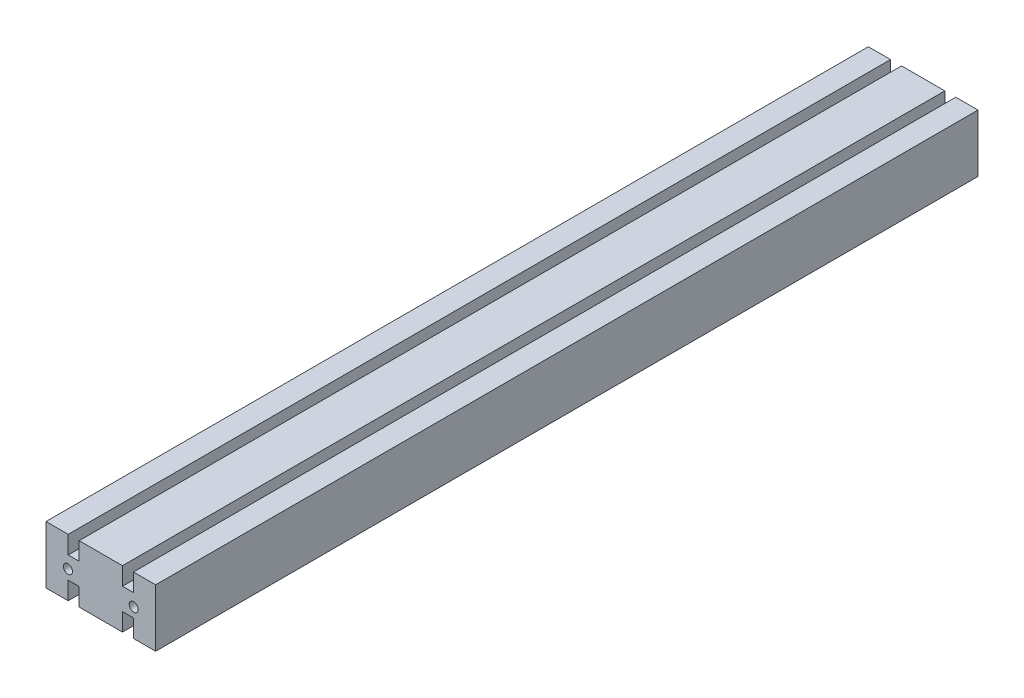
ISO-10303-21;
HEADER;
FILE_DESCRIPTION(('STEP AP214'),'2;1');
FILE_NAME('part.step','',(''),(''),'','','');
FILE_SCHEMA(('AUTOMOTIVE_DESIGN { 1 0 10303 214 1 1 1 1 }'));
ENDSEC;
DATA;
#1=APPLICATION_CONTEXT('core data for automotive mechanical design processes');
#2=APPLICATION_PROTOCOL_DEFINITION('international standard','automotive_design',2000,#1);
#3=PRODUCT_CONTEXT('',#1,'mechanical');
#4=PRODUCT('Part','Part','',(#3));
#5=PRODUCT_RELATED_PRODUCT_CATEGORY('part','',(#4));
#6=PRODUCT_DEFINITION_FORMATION('','',#4);
#7=PRODUCT_DEFINITION_CONTEXT('part definition',#1,'design');
#8=PRODUCT_DEFINITION('design','',#6,#7);
#9=PRODUCT_DEFINITION_SHAPE('','',#8);
#10=(LENGTH_UNIT() NAMED_UNIT(*) SI_UNIT(.MILLI.,.METRE.));
#11=(NAMED_UNIT(*) PLANE_ANGLE_UNIT() SI_UNIT($,.RADIAN.));
#12=(NAMED_UNIT(*) SI_UNIT($,.STERADIAN.) SOLID_ANGLE_UNIT());
#13=UNCERTAINTY_MEASURE_WITH_UNIT(LENGTH_MEASURE(1.E-05),#10,'distance_accuracy_value','');
#14=(GEOMETRIC_REPRESENTATION_CONTEXT(3) GLOBAL_UNCERTAINTY_ASSIGNED_CONTEXT((#13)) GLOBAL_UNIT_ASSIGNED_CONTEXT((#10,
#11,#12)) REPRESENTATION_CONTEXT('',''));
#15=CARTESIAN_POINT('',(0.,0.,0.));
#16=DIRECTION('',(0.,0.,1.));
#17=DIRECTION('',(1.,0.,0.));
#18=AXIS2_PLACEMENT_3D('',#15,#16,#17);
#19=CARTESIAN_POINT('',(-20.,10.5,150.));
#20=DIRECTION('',(0.,-1.,0.));
#21=DIRECTION('',(0.,0.,-1.));
#22=AXIS2_PLACEMENT_3D('',#19,#20,#21);
#23=PLANE('',#22);
#24=DIRECTION('',(-1.,0.,0.));
#25=VECTOR('',#24,1.);
#26=CARTESIAN_POINT('',(-20.,10.5,-150.));
#27=LINE('',#26,#25);
#28=CARTESIAN_POINT('',(7.9,10.5,-150.));
#29=VERTEX_POINT('',#28);
#30=CARTESIAN_POINT('',(-7.90000000000006,10.4999999999999,-150.));
#31=VERTEX_POINT('',#30);
#32=EDGE_CURVE('E343',#29,#31,#27,.T.);
#33=ORIENTED_EDGE('',*,*,#32,.T.);
#34=DIRECTION('',(0.,0.,1.));
#35=VECTOR('',#34,1.);
#36=CARTESIAN_POINT('',(-7.90000000000006,10.4999999999999,-150.));
#37=LINE('',#36,#35);
#38=CARTESIAN_POINT('',(-7.90000000000006,10.4999999999999,150.));
#39=VERTEX_POINT('',#38);
#40=EDGE_CURVE('E261',#31,#39,#37,.T.);
#41=ORIENTED_EDGE('',*,*,#40,.T.);
#42=DIRECTION('',(-1.,0.,0.));
#43=VECTOR('',#42,1.);
#44=CARTESIAN_POINT('',(-20.,10.5,150.));
#45=LINE('',#44,#43);
#46=CARTESIAN_POINT('',(7.9,10.5,150.));
#47=VERTEX_POINT('',#46);
#48=EDGE_CURVE('E328',#47,#39,#45,.T.);
#49=ORIENTED_EDGE('',*,*,#48,.F.);
#50=DIRECTION('',(0.,0.,1.));
#51=VECTOR('',#50,1.);
#52=CARTESIAN_POINT('',(7.9,10.5,-150.));
#53=LINE('',#52,#51);
#54=EDGE_CURVE('E310',#29,#47,#53,.T.);
#55=ORIENTED_EDGE('',*,*,#54,.F.);
#56=EDGE_LOOP('',(#33,#41,#49,#55));
#57=FACE_BOUND('',#56,.T.);
#58=ADVANCED_FACE('F38',(#57),#23,.F.);
#59=CARTESIAN_POINT('',(-11.9000000000001,10.4999999999999,150.));
#60=VERTEX_POINT('',#59);
#61=CARTESIAN_POINT('',(-20.,10.5,150.));
#62=VERTEX_POINT('',#61);
#63=EDGE_CURVE('E322',#60,#62,#45,.T.);
#64=ORIENTED_EDGE('',*,*,#63,.F.);
#65=DIRECTION('',(0.,0.,1.));
#66=VECTOR('',#65,1.);
#67=CARTESIAN_POINT('',(-11.9000000000001,10.4999999999999,-150.));
#68=LINE('',#67,#66);
#69=CARTESIAN_POINT('',(-11.9000000000001,10.4999999999999,-150.));
#70=VERTEX_POINT('',#69);
#71=EDGE_CURVE('E267',#70,#60,#68,.T.);
#72=ORIENTED_EDGE('',*,*,#71,.F.);
#73=CARTESIAN_POINT('',(-20.,10.5,-150.));
#74=VERTEX_POINT('',#73);
#75=EDGE_CURVE('E338',#70,#74,#27,.T.);
#76=ORIENTED_EDGE('',*,*,#75,.T.);
#77=DIRECTION('',(0.,0.,-1.));
#78=VECTOR('',#77,1.);
#79=CARTESIAN_POINT('',(-20.,10.5,150.));
#80=LINE('',#79,#78);
#81=EDGE_CURVE('E46',#62,#74,#80,.T.);
#82=ORIENTED_EDGE('',*,*,#81,.F.);
#83=EDGE_LOOP('',(#64,#72,#76,#82));
#84=FACE_BOUND('',#83,.T.);
#85=ADVANCED_FACE('F390',(#84),#23,.F.);
#86=CARTESIAN_POINT('',(-20.,-10.5,150.));
#87=DIRECTION('',(0.,1.,0.));
#88=DIRECTION('',(0.,0.,1.));
#89=AXIS2_PLACEMENT_3D('',#86,#87,#88);
#90=PLANE('',#89);
#91=DIRECTION('',(1.,0.,0.));
#92=VECTOR('',#91,1.);
#93=CARTESIAN_POINT('',(-20.,-10.5,-150.));
#94=LINE('',#93,#92);
#95=CARTESIAN_POINT('',(-7.90000000000008,-10.4999999999999,-150.));
#96=VERTEX_POINT('',#95);
#97=CARTESIAN_POINT('',(7.89999999999997,-10.5,-150.));
#98=VERTEX_POINT('',#97);
#99=EDGE_CURVE('E348',#96,#98,#94,.T.);
#100=ORIENTED_EDGE('',*,*,#99,.T.);
#101=DIRECTION('',(0.,0.,1.));
#102=VECTOR('',#101,1.);
#103=CARTESIAN_POINT('',(7.89999999999997,-10.5,-150.));
#104=LINE('',#103,#102);
#105=CARTESIAN_POINT('',(7.89999999999997,-10.5,150.));
#106=VERTEX_POINT('',#105);
#107=EDGE_CURVE('E285',#98,#106,#104,.T.);
#108=ORIENTED_EDGE('',*,*,#107,.T.);
#109=DIRECTION('',(1.,0.,0.));
#110=VECTOR('',#109,1.);
#111=CARTESIAN_POINT('',(-20.,-10.5,150.));
#112=LINE('',#111,#110);
#113=CARTESIAN_POINT('',(-7.90000000000008,-10.4999999999999,150.));
#114=VERTEX_POINT('',#113);
#115=EDGE_CURVE('E335',#114,#106,#112,.T.);
#116=ORIENTED_EDGE('',*,*,#115,.F.);
#117=DIRECTION('',(0.,0.,1.));
#118=VECTOR('',#117,1.);
#119=CARTESIAN_POINT('',(-7.90000000000008,-10.4999999999999,-150.));
#120=LINE('',#119,#118);
#121=EDGE_CURVE('E236',#96,#114,#120,.T.);
#122=ORIENTED_EDGE('',*,*,#121,.F.);
#123=EDGE_LOOP('',(#100,#108,#116,#122));
#124=FACE_BOUND('',#123,.T.);
#125=ADVANCED_FACE('F392',(#124),#90,.F.);
#126=CARTESIAN_POINT('',(11.9,-10.5,150.));
#127=VERTEX_POINT('',#126);
#128=CARTESIAN_POINT('',(20.,-10.5,150.));
#129=VERTEX_POINT('',#128);
#130=EDGE_CURVE('E330',#127,#129,#112,.T.);
#131=ORIENTED_EDGE('',*,*,#130,.F.);
#132=DIRECTION('',(0.,0.,1.));
#133=VECTOR('',#132,1.);
#134=CARTESIAN_POINT('',(11.9,-10.5,-150.));
#135=LINE('',#134,#133);
#136=CARTESIAN_POINT('',(11.9,-10.5,-150.));
#137=VERTEX_POINT('',#136);
#138=EDGE_CURVE('E289',#137,#127,#135,.T.);
#139=ORIENTED_EDGE('',*,*,#138,.F.);
#140=CARTESIAN_POINT('',(20.,-10.5,-150.));
#141=VERTEX_POINT('',#140);
#142=EDGE_CURVE('E345',#137,#141,#94,.T.);
#143=ORIENTED_EDGE('',*,*,#142,.T.);
#144=DIRECTION('',(0.,0.,-1.));
#145=VECTOR('',#144,1.);
#146=CARTESIAN_POINT('',(20.,-10.5,150.));
#147=LINE('',#146,#145);
#148=EDGE_CURVE('E334',#129,#141,#147,.T.);
#149=ORIENTED_EDGE('',*,*,#148,.F.);
#150=EDGE_LOOP('',(#131,#139,#143,#149));
#151=FACE_BOUND('',#150,.T.);
#152=ADVANCED_FACE('F398',(#151),#90,.F.);
#153=CARTESIAN_POINT('',(20.,-10.5,150.));
#154=DIRECTION('',(-1.,0.,0.));
#155=DIRECTION('',(0.,0.,1.));
#156=AXIS2_PLACEMENT_3D('',#153,#154,#155);
#157=PLANE('',#156);
#158=DIRECTION('',(0.,1.,0.));
#159=VECTOR('',#158,1.);
#160=CARTESIAN_POINT('',(20.,-10.5,-150.));
#161=LINE('',#160,#159);
#162=CARTESIAN_POINT('',(20.,10.5,-150.));
#163=VERTEX_POINT('',#162);
#164=EDGE_CURVE('E312',#141,#163,#161,.T.);
#165=ORIENTED_EDGE('',*,*,#164,.T.);
#166=DIRECTION('',(0.,0.,-1.));
#167=VECTOR('',#166,1.);
#168=CARTESIAN_POINT('',(20.,10.5,150.));
#169=LINE('',#168,#167);
#170=CARTESIAN_POINT('',(20.,10.5,150.));
#171=VERTEX_POINT('',#170);
#172=EDGE_CURVE('E11',#171,#163,#169,.T.);
#173=ORIENTED_EDGE('',*,*,#172,.F.);
#174=DIRECTION('',(0.,1.,0.));
#175=VECTOR('',#174,1.);
#176=CARTESIAN_POINT('',(20.,-10.5,150.));
#177=LINE('',#176,#175);
#178=EDGE_CURVE('E319',#129,#171,#177,.T.);
#179=ORIENTED_EDGE('',*,*,#178,.F.);
#180=ORIENTED_EDGE('',*,*,#148,.T.);
#181=EDGE_LOOP('',(#165,#173,#179,#180));
#182=FACE_BOUND('',#181,.T.);
#183=ADVANCED_FACE('F40',(#182),#157,.F.);
#184=CARTESIAN_POINT('',(11.9,10.5,-150.));
#185=VERTEX_POINT('',#184);
#186=EDGE_CURVE('E339',#163,#185,#27,.T.);
#187=ORIENTED_EDGE('',*,*,#186,.T.);
#188=DIRECTION('',(0.,0.,1.));
#189=VECTOR('',#188,1.);
#190=CARTESIAN_POINT('',(11.9,10.5,-150.));
#191=LINE('',#190,#189);
#192=CARTESIAN_POINT('',(11.9,10.5,150.));
#193=VERTEX_POINT('',#192);
#194=EDGE_CURVE('E313',#185,#193,#191,.T.);
#195=ORIENTED_EDGE('',*,*,#194,.T.);
#196=EDGE_CURVE('E324',#171,#193,#45,.T.);
#197=ORIENTED_EDGE('',*,*,#196,.F.);
#198=ORIENTED_EDGE('',*,*,#172,.T.);
#199=EDGE_LOOP('',(#187,#195,#197,#198));
#200=FACE_BOUND('',#199,.T.);
#201=ADVANCED_FACE('F393',(#200),#23,.F.);
#202=CARTESIAN_POINT('',(-20.,-10.5,150.));
#203=DIRECTION('',(1.,0.,0.));
#204=DIRECTION('',(0.,0.,-1.));
#205=AXIS2_PLACEMENT_3D('',#202,#203,#204);
#206=PLANE('',#205);
#207=DIRECTION('',(0.,-1.,0.));
#208=VECTOR('',#207,1.);
#209=CARTESIAN_POINT('',(-20.,-10.5,-150.));
#210=LINE('',#209,#208);
#211=CARTESIAN_POINT('',(-20.,-10.5,-150.));
#212=VERTEX_POINT('',#211);
#213=EDGE_CURVE('E342',#74,#212,#210,.T.);
#214=ORIENTED_EDGE('',*,*,#213,.T.);
#215=DIRECTION('',(0.,0.,-1.));
#216=VECTOR('',#215,1.);
#217=CARTESIAN_POINT('',(-20.,-10.5,150.));
#218=LINE('',#217,#216);
#219=CARTESIAN_POINT('',(-20.,-10.5,150.));
#220=VERTEX_POINT('',#219);
#221=EDGE_CURVE('E351',#220,#212,#218,.T.);
#222=ORIENTED_EDGE('',*,*,#221,.F.);
#223=DIRECTION('',(0.,-1.,0.));
#224=VECTOR('',#223,1.);
#225=CARTESIAN_POINT('',(-20.,-10.5,150.));
#226=LINE('',#225,#224);
#227=EDGE_CURVE('E327',#62,#220,#226,.T.);
#228=ORIENTED_EDGE('',*,*,#227,.F.);
#229=ORIENTED_EDGE('',*,*,#81,.T.);
#230=EDGE_LOOP('',(#214,#222,#228,#229));
#231=FACE_BOUND('',#230,.T.);
#232=ADVANCED_FACE('F358',(#231),#206,.F.);
#233=CARTESIAN_POINT('',(-11.9000000000001,-10.4999999999999,-150.));
#234=VERTEX_POINT('',#233);
#235=EDGE_CURVE('E323',#212,#234,#94,.T.);
#236=ORIENTED_EDGE('',*,*,#235,.T.);
#237=DIRECTION('',(0.,0.,1.));
#238=VECTOR('',#237,1.);
#239=CARTESIAN_POINT('',(-11.9000000000001,-10.4999999999999,-150.));
#240=LINE('',#239,#238);
#241=CARTESIAN_POINT('',(-11.9000000000001,-10.4999999999999,150.));
#242=VERTEX_POINT('',#241);
#243=EDGE_CURVE('E239',#234,#242,#240,.T.);
#244=ORIENTED_EDGE('',*,*,#243,.T.);
#245=EDGE_CURVE('E331',#220,#242,#112,.T.);
#246=ORIENTED_EDGE('',*,*,#245,.F.);
#247=ORIENTED_EDGE('',*,*,#221,.T.);
#248=EDGE_LOOP('',(#236,#244,#246,#247));
#249=FACE_BOUND('',#248,.T.);
#250=ADVANCED_FACE('F367',(#249),#90,.F.);
#251=CARTESIAN_POINT('',(0.,0.,150.));
#252=DIRECTION('',(0.,0.,-1.));
#253=DIRECTION('',(-1.,0.,0.));
#254=AXIS2_PLACEMENT_3D('',#251,#252,#253);
#255=PLANE('',#254);
#256=CARTESIAN_POINT('',(-12.,-0.499999999999919,150.));
#257=DIRECTION('',(0.,0.,1.));
#258=DIRECTION('',(1.,0.,0.));
#259=AXIS2_PLACEMENT_3D('',#256,#257,#258);
#260=CIRCLE('',#259,1.65);
#261=CARTESIAN_POINT('',(-10.35,-0.499999999999919,150.));
#262=VERTEX_POINT('',#261);
#263=EDGE_CURVE('E206',#262,#262,#260,.T.);
#264=ORIENTED_EDGE('',*,*,#263,.F.);
#265=EDGE_LOOP('',(#264));
#266=FACE_BOUND('',#265,.T.);
#267=CARTESIAN_POINT('',(12.,-0.499999999999914,150.));
#268=DIRECTION('',(0.,0.,1.));
#269=DIRECTION('',(1.,0.,0.));
#270=AXIS2_PLACEMENT_3D('',#267,#268,#269);
#271=CIRCLE('',#270,1.65);
#272=CARTESIAN_POINT('',(13.65,-0.499999999999914,150.));
#273=VERTEX_POINT('',#272);
#274=EDGE_CURVE('E212',#273,#273,#271,.T.);
#275=ORIENTED_EDGE('',*,*,#274,.F.);
#276=EDGE_LOOP('',(#275));
#277=FACE_BOUND('',#276,.T.);
#278=ORIENTED_EDGE('',*,*,#48,.T.);
#279=DIRECTION('',(0.,1.,0.));
#280=VECTOR('',#279,1.);
#281=CARTESIAN_POINT('',(-7.90000000000006,10.4999999999999,150.));
#282=LINE('',#281,#280);
#283=CARTESIAN_POINT('',(-7.90000000000002,3.99999999999994,150.));
#284=VERTEX_POINT('',#283);
#285=EDGE_CURVE('E245',#284,#39,#282,.T.);
#286=ORIENTED_EDGE('',*,*,#285,.F.);
#287=DIRECTION('',(1.,0.,0.));
#288=VECTOR('',#287,1.);
#289=CARTESIAN_POINT('',(-7.90000000000002,3.99999999999994,150.));
#290=LINE('',#289,#288);
#291=CARTESIAN_POINT('',(-11.9,3.99999999999992,150.));
#292=VERTEX_POINT('',#291);
#293=EDGE_CURVE('E251',#292,#284,#290,.T.);
#294=ORIENTED_EDGE('',*,*,#293,.F.);
#295=DIRECTION('',(0.,-1.,0.));
#296=VECTOR('',#295,1.);
#297=CARTESIAN_POINT('',(-11.9000000000001,10.4999999999999,150.));
#298=LINE('',#297,#296);
#299=EDGE_CURVE('E247',#60,#292,#298,.T.);
#300=ORIENTED_EDGE('',*,*,#299,.F.);
#301=ORIENTED_EDGE('',*,*,#63,.T.);
#302=ORIENTED_EDGE('',*,*,#227,.T.);
#303=ORIENTED_EDGE('',*,*,#245,.T.);
#304=DIRECTION('',(0.,-1.,0.));
#305=VECTOR('',#304,1.);
#306=CARTESIAN_POINT('',(-11.9000000000001,-10.4999999999999,150.));
#307=LINE('',#306,#305);
#308=CARTESIAN_POINT('',(-11.9,-3.99999999999989,150.));
#309=VERTEX_POINT('',#308);
#310=EDGE_CURVE('E224',#309,#242,#307,.T.);
#311=ORIENTED_EDGE('',*,*,#310,.F.);
#312=DIRECTION('',(-1.,0.,0.));
#313=VECTOR('',#312,1.);
#314=CARTESIAN_POINT('',(-7.90000000000003,-3.99999999999992,150.));
#315=LINE('',#314,#313);
#316=CARTESIAN_POINT('',(-7.90000000000003,-3.99999999999992,150.));
#317=VERTEX_POINT('',#316);
#318=EDGE_CURVE('E221',#317,#309,#315,.T.);
#319=ORIENTED_EDGE('',*,*,#318,.F.);
#320=DIRECTION('',(0.,1.,0.));
#321=VECTOR('',#320,1.);
#322=CARTESIAN_POINT('',(-7.90000000000008,-10.4999999999999,150.));
#323=LINE('',#322,#321);
#324=EDGE_CURVE('E218',#114,#317,#323,.T.);
#325=ORIENTED_EDGE('',*,*,#324,.F.);
#326=ORIENTED_EDGE('',*,*,#115,.T.);
#327=DIRECTION('',(0.,-1.,0.));
#328=VECTOR('',#327,1.);
#329=CARTESIAN_POINT('',(7.89999999999997,-10.5,150.));
#330=LINE('',#329,#328);
#331=CARTESIAN_POINT('',(7.89999999999999,-4.00000000000001,150.));
#332=VERTEX_POINT('',#331);
#333=EDGE_CURVE('E238',#332,#106,#330,.T.);
#334=ORIENTED_EDGE('',*,*,#333,.F.);
#335=DIRECTION('',(-1.,0.,0.));
#336=VECTOR('',#335,1.);
#337=CARTESIAN_POINT('',(7.89999999999999,-4.00000000000001,150.));
#338=LINE('',#337,#336);
#339=CARTESIAN_POINT('',(11.9,-4.00000000000002,150.));
#340=VERTEX_POINT('',#339);
#341=EDGE_CURVE('E275',#340,#332,#338,.T.);
#342=ORIENTED_EDGE('',*,*,#341,.F.);
#343=DIRECTION('',(0.,1.,0.));
#344=VECTOR('',#343,1.);
#345=CARTESIAN_POINT('',(11.9,-10.5,150.));
#346=LINE('',#345,#344);
#347=EDGE_CURVE('E272',#127,#340,#346,.T.);
#348=ORIENTED_EDGE('',*,*,#347,.F.);
#349=ORIENTED_EDGE('',*,*,#130,.T.);
#350=ORIENTED_EDGE('',*,*,#178,.T.);
#351=ORIENTED_EDGE('',*,*,#196,.T.);
#352=DIRECTION('',(0.,1.,0.));
#353=VECTOR('',#352,1.);
#354=CARTESIAN_POINT('',(11.9,10.5,150.));
#355=LINE('',#354,#353);
#356=CARTESIAN_POINT('',(11.9,3.99999999999998,150.));
#357=VERTEX_POINT('',#356);
#358=EDGE_CURVE('E298',#357,#193,#355,.T.);
#359=ORIENTED_EDGE('',*,*,#358,.F.);
#360=DIRECTION('',(1.,0.,0.));
#361=VECTOR('',#360,1.);
#362=CARTESIAN_POINT('',(7.9,3.99999999999998,150.));
#363=LINE('',#362,#361);
#364=CARTESIAN_POINT('',(7.9,3.99999999999998,150.));
#365=VERTEX_POINT('',#364);
#366=EDGE_CURVE('E295',#365,#357,#363,.T.);
#367=ORIENTED_EDGE('',*,*,#366,.F.);
#368=DIRECTION('',(0.,-1.,0.));
#369=VECTOR('',#368,1.);
#370=CARTESIAN_POINT('',(7.9,10.5,150.));
#371=LINE('',#370,#369);
#372=EDGE_CURVE('E264',#47,#365,#371,.T.);
#373=ORIENTED_EDGE('',*,*,#372,.F.);
#374=EDGE_LOOP('',(#278,#286,#294,#300,#301,#302,#303,#311,#319,#325,#326,#334,#342,#348,#349,
#350,#351,#359,#367,#373));
#375=FACE_BOUND('',#374,.T.);
#376=ADVANCED_FACE('F372',(#266,#277,#375),#255,.F.);
#377=CARTESIAN_POINT('',(0.,0.,-150.));
#378=DIRECTION('',(0.,0.,-1.));
#379=DIRECTION('',(-1.,0.,0.));
#380=AXIS2_PLACEMENT_3D('',#377,#378,#379);
#381=PLANE('',#380);
#382=CARTESIAN_POINT('',(12.,-0.499999999999914,-150.));
#383=DIRECTION('',(0.,0.,-1.));
#384=DIRECTION('',(-1.,0.,0.));
#385=AXIS2_PLACEMENT_3D('',#382,#383,#384);
#386=CIRCLE('',#385,1.64999999999999);
#387=CARTESIAN_POINT('',(10.35,-0.499999999999914,-150.));
#388=VERTEX_POINT('',#387);
#389=EDGE_CURVE('E196',#388,#388,#386,.T.);
#390=ORIENTED_EDGE('',*,*,#389,.F.);
#391=EDGE_LOOP('',(#390));
#392=FACE_BOUND('',#391,.T.);
#393=CARTESIAN_POINT('',(-12.,-0.499999999999919,-150.));
#394=DIRECTION('',(0.,0.,-1.));
#395=DIRECTION('',(-1.,0.,0.));
#396=AXIS2_PLACEMENT_3D('',#393,#394,#395);
#397=CIRCLE('',#396,1.64999999999999);
#398=CARTESIAN_POINT('',(-13.65,-0.499999999999919,-150.));
#399=VERTEX_POINT('',#398);
#400=EDGE_CURVE('E195',#399,#399,#397,.T.);
#401=ORIENTED_EDGE('',*,*,#400,.F.);
#402=EDGE_LOOP('',(#401));
#403=FACE_BOUND('',#402,.T.);
#404=DIRECTION('',(0.,1.,0.));
#405=VECTOR('',#404,1.);
#406=CARTESIAN_POINT('',(-7.90000000000006,10.4999999999999,-150.));
#407=LINE('',#406,#405);
#408=CARTESIAN_POINT('',(-7.90000000000002,3.99999999999994,-150.));
#409=VERTEX_POINT('',#408);
#410=EDGE_CURVE('E254',#409,#31,#407,.T.);
#411=ORIENTED_EDGE('',*,*,#410,.T.);
#412=ORIENTED_EDGE('',*,*,#32,.F.);
#413=DIRECTION('',(0.,-1.,0.));
#414=VECTOR('',#413,1.);
#415=CARTESIAN_POINT('',(7.9,10.5,-150.));
#416=LINE('',#415,#414);
#417=CARTESIAN_POINT('',(7.9,3.99999999999998,-150.));
#418=VERTEX_POINT('',#417);
#419=EDGE_CURVE('E300',#29,#418,#416,.T.);
#420=ORIENTED_EDGE('',*,*,#419,.T.);
#421=DIRECTION('',(1.,0.,0.));
#422=VECTOR('',#421,1.);
#423=CARTESIAN_POINT('',(7.9,3.99999999999998,-150.));
#424=LINE('',#423,#422);
#425=CARTESIAN_POINT('',(11.9,3.99999999999998,-150.));
#426=VERTEX_POINT('',#425);
#427=EDGE_CURVE('E303',#418,#426,#424,.T.);
#428=ORIENTED_EDGE('',*,*,#427,.T.);
#429=DIRECTION('',(0.,1.,0.));
#430=VECTOR('',#429,1.);
#431=CARTESIAN_POINT('',(11.9,10.5,-150.));
#432=LINE('',#431,#430);
#433=EDGE_CURVE('E306',#426,#185,#432,.T.);
#434=ORIENTED_EDGE('',*,*,#433,.T.);
#435=ORIENTED_EDGE('',*,*,#186,.F.);
#436=ORIENTED_EDGE('',*,*,#164,.F.);
#437=ORIENTED_EDGE('',*,*,#142,.F.);
#438=DIRECTION('',(0.,1.,0.));
#439=VECTOR('',#438,1.);
#440=CARTESIAN_POINT('',(11.9,-10.5,-150.));
#441=LINE('',#440,#439);
#442=CARTESIAN_POINT('',(11.9,-4.00000000000002,-150.));
#443=VERTEX_POINT('',#442);
#444=EDGE_CURVE('E281',#137,#443,#441,.T.);
#445=ORIENTED_EDGE('',*,*,#444,.T.);
#446=DIRECTION('',(-1.,0.,0.));
#447=VECTOR('',#446,1.);
#448=CARTESIAN_POINT('',(7.89999999999999,-4.00000000000001,-150.));
#449=LINE('',#448,#447);
#450=CARTESIAN_POINT('',(7.89999999999999,-4.00000000000001,-150.));
#451=VERTEX_POINT('',#450);
#452=EDGE_CURVE('E61',#443,#451,#449,.T.);
#453=ORIENTED_EDGE('',*,*,#452,.T.);
#454=DIRECTION('',(0.,-1.,0.));
#455=VECTOR('',#454,1.);
#456=CARTESIAN_POINT('',(7.89999999999997,-10.5,-150.));
#457=LINE('',#456,#455);
#458=EDGE_CURVE('E278',#451,#98,#457,.T.);
#459=ORIENTED_EDGE('',*,*,#458,.T.);
#460=ORIENTED_EDGE('',*,*,#99,.F.);
#461=DIRECTION('',(0.,1.,0.));
#462=VECTOR('',#461,1.);
#463=CARTESIAN_POINT('',(-7.90000000000008,-10.4999999999999,-150.));
#464=LINE('',#463,#462);
#465=CARTESIAN_POINT('',(-7.90000000000003,-3.99999999999992,-150.));
#466=VERTEX_POINT('',#465);
#467=EDGE_CURVE('E226',#96,#466,#464,.T.);
#468=ORIENTED_EDGE('',*,*,#467,.T.);
#469=DIRECTION('',(-1.,0.,0.));
#470=VECTOR('',#469,1.);
#471=CARTESIAN_POINT('',(-7.90000000000003,-3.99999999999992,-150.));
#472=LINE('',#471,#470);
#473=CARTESIAN_POINT('',(-11.9,-3.99999999999989,-150.));
#474=VERTEX_POINT('',#473);
#475=EDGE_CURVE('E229',#466,#474,#472,.T.);
#476=ORIENTED_EDGE('',*,*,#475,.T.);
#477=DIRECTION('',(0.,-1.,0.));
#478=VECTOR('',#477,1.);
#479=CARTESIAN_POINT('',(-11.9000000000001,-10.4999999999999,-150.));
#480=LINE('',#479,#478);
#481=EDGE_CURVE('E232',#474,#234,#480,.T.);
#482=ORIENTED_EDGE('',*,*,#481,.T.);
#483=ORIENTED_EDGE('',*,*,#235,.F.);
#484=ORIENTED_EDGE('',*,*,#213,.F.);
#485=ORIENTED_EDGE('',*,*,#75,.F.);
#486=DIRECTION('',(0.,-1.,0.));
#487=VECTOR('',#486,1.);
#488=CARTESIAN_POINT('',(-11.9000000000001,10.4999999999999,-150.));
#489=LINE('',#488,#487);
#490=CARTESIAN_POINT('',(-11.9,3.99999999999992,-150.));
#491=VERTEX_POINT('',#490);
#492=EDGE_CURVE('E257',#70,#491,#489,.T.);
#493=ORIENTED_EDGE('',*,*,#492,.T.);
#494=DIRECTION('',(1.,0.,0.));
#495=VECTOR('',#494,1.);
#496=CARTESIAN_POINT('',(-7.90000000000002,3.99999999999994,-150.));
#497=LINE('',#496,#495);
#498=EDGE_CURVE('E53',#491,#409,#497,.T.);
#499=ORIENTED_EDGE('',*,*,#498,.T.);
#500=EDGE_LOOP('',(#411,#412,#420,#428,#434,#435,#436,#437,#445,#453,#459,#460,#468,#476,#482,
#483,#484,#485,#493,#499));
#501=FACE_BOUND('',#500,.T.);
#502=ADVANCED_FACE('F365',(#392,#403,#501),#381,.T.);
#503=CARTESIAN_POINT('',(7.9,10.5,-150.));
#504=DIRECTION('',(-1.,0.,0.));
#505=DIRECTION('',(0.,0.,1.));
#506=AXIS2_PLACEMENT_3D('',#503,#504,#505);
#507=PLANE('',#506);
#508=DIRECTION('',(0.,0.,1.));
#509=VECTOR('',#508,1.);
#510=CARTESIAN_POINT('',(7.9,3.99999999999998,-150.));
#511=LINE('',#510,#509);
#512=EDGE_CURVE('E309',#418,#365,#511,.T.);
#513=ORIENTED_EDGE('',*,*,#512,.F.);
#514=ORIENTED_EDGE('',*,*,#419,.F.);
#515=ORIENTED_EDGE('',*,*,#54,.T.);
#516=ORIENTED_EDGE('',*,*,#372,.T.);
#517=EDGE_LOOP('',(#513,#514,#515,#516));
#518=FACE_BOUND('',#517,.T.);
#519=ADVANCED_FACE('F474',(#518),#507,.F.);
#520=CARTESIAN_POINT('',(11.9,10.5,-150.));
#521=DIRECTION('',(1.,0.,0.));
#522=DIRECTION('',(0.,0.,-1.));
#523=AXIS2_PLACEMENT_3D('',#520,#521,#522);
#524=PLANE('',#523);
#525=ORIENTED_EDGE('',*,*,#194,.F.);
#526=ORIENTED_EDGE('',*,*,#433,.F.);
#527=DIRECTION('',(0.,0.,1.));
#528=VECTOR('',#527,1.);
#529=CARTESIAN_POINT('',(11.9,3.99999999999998,-150.));
#530=LINE('',#529,#528);
#531=EDGE_CURVE('E316',#426,#357,#530,.T.);
#532=ORIENTED_EDGE('',*,*,#531,.T.);
#533=ORIENTED_EDGE('',*,*,#358,.T.);
#534=EDGE_LOOP('',(#525,#526,#532,#533));
#535=FACE_BOUND('',#534,.T.);
#536=ADVANCED_FACE('F415',(#535),#524,.F.);
#537=CARTESIAN_POINT('',(7.9,3.99999999999998,-150.));
#538=DIRECTION('',(0.,-1.,0.));
#539=DIRECTION('',(0.,0.,-1.));
#540=AXIS2_PLACEMENT_3D('',#537,#538,#539);
#541=PLANE('',#540);
#542=ORIENTED_EDGE('',*,*,#531,.F.);
#543=ORIENTED_EDGE('',*,*,#427,.F.);
#544=ORIENTED_EDGE('',*,*,#512,.T.);
#545=ORIENTED_EDGE('',*,*,#366,.T.);
#546=EDGE_LOOP('',(#542,#543,#544,#545));
#547=FACE_BOUND('',#546,.T.);
#548=ADVANCED_FACE('F417',(#547),#541,.F.);
#549=CARTESIAN_POINT('',(-7.90000000000008,-10.4999999999999,-150.));
#550=DIRECTION('',(1.,0.,0.));
#551=DIRECTION('',(0.,1.,0.));
#552=AXIS2_PLACEMENT_3D('',#549,#550,#551);
#553=PLANE('',#552);
#554=DIRECTION('',(0.,0.,1.));
#555=VECTOR('',#554,1.);
#556=CARTESIAN_POINT('',(-7.90000000000003,-3.99999999999992,-150.));
#557=LINE('',#556,#555);
#558=EDGE_CURVE('E235',#466,#317,#557,.T.);
#559=ORIENTED_EDGE('',*,*,#558,.F.);
#560=ORIENTED_EDGE('',*,*,#467,.F.);
#561=ORIENTED_EDGE('',*,*,#121,.T.);
#562=ORIENTED_EDGE('',*,*,#324,.T.);
#563=EDGE_LOOP('',(#559,#560,#561,#562));
#564=FACE_BOUND('',#563,.T.);
#565=ADVANCED_FACE('F437',(#564),#553,.F.);
#566=CARTESIAN_POINT('',(-11.9000000000001,-10.4999999999999,-150.));
#567=DIRECTION('',(-1.,0.,0.));
#568=DIRECTION('',(0.,-1.,0.));
#569=AXIS2_PLACEMENT_3D('',#566,#567,#568);
#570=PLANE('',#569);
#571=ORIENTED_EDGE('',*,*,#243,.F.);
#572=ORIENTED_EDGE('',*,*,#481,.F.);
#573=DIRECTION('',(0.,0.,1.));
#574=VECTOR('',#573,1.);
#575=CARTESIAN_POINT('',(-11.9,-3.99999999999989,-150.));
#576=LINE('',#575,#574);
#577=EDGE_CURVE('E242',#474,#309,#576,.T.);
#578=ORIENTED_EDGE('',*,*,#577,.T.);
#579=ORIENTED_EDGE('',*,*,#310,.T.);
#580=EDGE_LOOP('',(#571,#572,#578,#579));
#581=FACE_BOUND('',#580,.T.);
#582=ADVANCED_FACE('F443',(#581),#570,.F.);
#583=CARTESIAN_POINT('',(-7.90000000000003,-3.99999999999992,-150.));
#584=DIRECTION('',(0.,1.,0.));
#585=DIRECTION('',(-1.,0.,0.));
#586=AXIS2_PLACEMENT_3D('',#583,#584,#585);
#587=PLANE('',#586);
#588=ORIENTED_EDGE('',*,*,#577,.F.);
#589=ORIENTED_EDGE('',*,*,#475,.F.);
#590=ORIENTED_EDGE('',*,*,#558,.T.);
#591=ORIENTED_EDGE('',*,*,#318,.T.);
#592=EDGE_LOOP('',(#588,#589,#590,#591));
#593=FACE_BOUND('',#592,.T.);
#594=ADVANCED_FACE('F441',(#593),#587,.F.);
#595=CARTESIAN_POINT('',(7.89999999999997,-10.5,-150.));
#596=DIRECTION('',(-1.,0.,0.));
#597=DIRECTION('',(0.,-1.,0.));
#598=AXIS2_PLACEMENT_3D('',#595,#596,#597);
#599=PLANE('',#598);
#600=ORIENTED_EDGE('',*,*,#107,.F.);
#601=ORIENTED_EDGE('',*,*,#458,.F.);
#602=DIRECTION('',(0.,0.,1.));
#603=VECTOR('',#602,1.);
#604=CARTESIAN_POINT('',(7.89999999999999,-4.00000000000001,-150.));
#605=LINE('',#604,#603);
#606=EDGE_CURVE('E248',#451,#332,#605,.T.);
#607=ORIENTED_EDGE('',*,*,#606,.T.);
#608=ORIENTED_EDGE('',*,*,#333,.T.);
#609=EDGE_LOOP('',(#600,#601,#607,#608));
#610=FACE_BOUND('',#609,.T.);
#611=ADVANCED_FACE('F432',(#610),#599,.F.);
#612=CARTESIAN_POINT('',(7.89999999999999,-4.00000000000001,-150.));
#613=DIRECTION('',(0.,1.,0.));
#614=DIRECTION('',(-1.,0.,0.));
#615=AXIS2_PLACEMENT_3D('',#612,#613,#614);
#616=PLANE('',#615);
#617=ORIENTED_EDGE('',*,*,#606,.F.);
#618=ORIENTED_EDGE('',*,*,#452,.F.);
#619=DIRECTION('',(0.,0.,1.));
#620=VECTOR('',#619,1.);
#621=CARTESIAN_POINT('',(11.9,-4.00000000000002,-150.));
#622=LINE('',#621,#620);
#623=EDGE_CURVE('E287',#443,#340,#622,.T.);
#624=ORIENTED_EDGE('',*,*,#623,.T.);
#625=ORIENTED_EDGE('',*,*,#341,.T.);
#626=EDGE_LOOP('',(#617,#618,#624,#625));
#627=FACE_BOUND('',#626,.T.);
#628=ADVANCED_FACE('F464',(#627),#616,.F.);
#629=CARTESIAN_POINT('',(11.9,-10.5,-150.));
#630=DIRECTION('',(1.,0.,0.));
#631=DIRECTION('',(0.,1.,0.));
#632=AXIS2_PLACEMENT_3D('',#629,#630,#631);
#633=PLANE('',#632);
#634=ORIENTED_EDGE('',*,*,#623,.F.);
#635=ORIENTED_EDGE('',*,*,#444,.F.);
#636=ORIENTED_EDGE('',*,*,#138,.T.);
#637=ORIENTED_EDGE('',*,*,#347,.T.);
#638=EDGE_LOOP('',(#634,#635,#636,#637));
#639=FACE_BOUND('',#638,.T.);
#640=ADVANCED_FACE('F463',(#639),#633,.F.);
#641=CARTESIAN_POINT('',(-7.90000000000006,10.4999999999999,-150.));
#642=DIRECTION('',(1.,0.,0.));
#643=DIRECTION('',(0.,1.,0.));
#644=AXIS2_PLACEMENT_3D('',#641,#642,#643);
#645=PLANE('',#644);
#646=ORIENTED_EDGE('',*,*,#40,.F.);
#647=ORIENTED_EDGE('',*,*,#410,.F.);
#648=DIRECTION('',(0.,0.,1.));
#649=VECTOR('',#648,1.);
#650=CARTESIAN_POINT('',(-7.90000000000002,3.99999999999994,-150.));
#651=LINE('',#650,#649);
#652=EDGE_CURVE('E262',#409,#284,#651,.T.);
#653=ORIENTED_EDGE('',*,*,#652,.T.);
#654=ORIENTED_EDGE('',*,*,#285,.T.);
#655=EDGE_LOOP('',(#646,#647,#653,#654));
#656=FACE_BOUND('',#655,.T.);
#657=ADVANCED_FACE('F387',(#656),#645,.F.);
#658=CARTESIAN_POINT('',(-7.90000000000002,3.99999999999994,-150.));
#659=DIRECTION('',(0.,-1.,0.));
#660=DIRECTION('',(1.,0.,0.));
#661=AXIS2_PLACEMENT_3D('',#658,#659,#660);
#662=PLANE('',#661);
#663=ORIENTED_EDGE('',*,*,#652,.F.);
#664=ORIENTED_EDGE('',*,*,#498,.F.);
#665=DIRECTION('',(0.,0.,1.));
#666=VECTOR('',#665,1.);
#667=CARTESIAN_POINT('',(-11.9,3.99999999999992,-150.));
#668=LINE('',#667,#666);
#669=EDGE_CURVE('E265',#491,#292,#668,.T.);
#670=ORIENTED_EDGE('',*,*,#669,.T.);
#671=ORIENTED_EDGE('',*,*,#293,.T.);
#672=EDGE_LOOP('',(#663,#664,#670,#671));
#673=FACE_BOUND('',#672,.T.);
#674=ADVANCED_FACE('F456',(#673),#662,.F.);
#675=CARTESIAN_POINT('',(-11.9000000000001,10.4999999999999,-150.));
#676=DIRECTION('',(-1.,0.,0.));
#677=DIRECTION('',(0.,-1.,0.));
#678=AXIS2_PLACEMENT_3D('',#675,#676,#677);
#679=PLANE('',#678);
#680=ORIENTED_EDGE('',*,*,#669,.F.);
#681=ORIENTED_EDGE('',*,*,#492,.F.);
#682=ORIENTED_EDGE('',*,*,#71,.T.);
#683=ORIENTED_EDGE('',*,*,#299,.T.);
#684=EDGE_LOOP('',(#680,#681,#682,#683));
#685=FACE_BOUND('',#684,.T.);
#686=ADVANCED_FACE('F389',(#685),#679,.F.);
#687=CARTESIAN_POINT('',(12.,-0.499999999999914,139.9));
#688=DIRECTION('',(0.,0.,1.));
#689=DIRECTION('',(1.,0.,0.));
#690=AXIS2_PLACEMENT_3D('',#687,#688,#689);
#691=CONICAL_SURFACE('',#690,1.65,1.02974425867665);
#692=CARTESIAN_POINT('',(12.,-0.499999999999914,138.908579978605));
#693=VERTEX_POINT('',#692);
#694=VERTEX_LOOP('',#693);
#695=FACE_BOUND('',#694,.T.);
#696=CARTESIAN_POINT('',(12.,-0.499999999999914,139.9));
#697=DIRECTION('',(0.,0.,1.));
#698=DIRECTION('',(1.,0.,0.));
#699=AXIS2_PLACEMENT_3D('',#696,#697,#698);
#700=CIRCLE('',#699,1.65);
#701=CARTESIAN_POINT('',(13.65,-0.499999999999914,139.9));
#702=VERTEX_POINT('',#701);
#703=EDGE_CURVE('E215',#702,#702,#700,.T.);
#704=ORIENTED_EDGE('',*,*,#703,.T.);
#705=EDGE_LOOP('',(#704));
#706=FACE_BOUND('',#705,.T.);
#707=ADVANCED_FACE('F453',(#695,#706),#691,.F.);
#708=CARTESIAN_POINT('',(12.,-0.499999999999914,150.));
#709=DIRECTION('',(0.,0.,1.));
#710=DIRECTION('',(1.,0.,0.));
#711=AXIS2_PLACEMENT_3D('',#708,#709,#710);
#712=CYLINDRICAL_SURFACE('',#711,1.65);
#713=ORIENTED_EDGE('',*,*,#703,.F.);
#714=EDGE_LOOP('',(#713));
#715=FACE_BOUND('',#714,.T.);
#716=ORIENTED_EDGE('',*,*,#274,.T.);
#717=EDGE_LOOP('',(#716));
#718=FACE_BOUND('',#717,.T.);
#719=ADVANCED_FACE('F616',(#715,#718),#712,.F.);
#720=CARTESIAN_POINT('',(-12.,-0.499999999999919,139.9));
#721=DIRECTION('',(0.,0.,1.));
#722=DIRECTION('',(1.,0.,0.));
#723=AXIS2_PLACEMENT_3D('',#720,#721,#722);
#724=CONICAL_SURFACE('',#723,1.65,1.02974425867665);
#725=CARTESIAN_POINT('',(-12.,-0.499999999999919,138.908579978605));
#726=VERTEX_POINT('',#725);
#727=VERTEX_LOOP('',#726);
#728=FACE_BOUND('',#727,.T.);
#729=CARTESIAN_POINT('',(-12.,-0.499999999999919,139.9));
#730=DIRECTION('',(0.,0.,1.));
#731=DIRECTION('',(1.,0.,0.));
#732=AXIS2_PLACEMENT_3D('',#729,#730,#731);
#733=CIRCLE('',#732,1.65);
#734=CARTESIAN_POINT('',(-10.35,-0.499999999999919,139.9));
#735=VERTEX_POINT('',#734);
#736=EDGE_CURVE('E209',#735,#735,#733,.T.);
#737=ORIENTED_EDGE('',*,*,#736,.T.);
#738=EDGE_LOOP('',(#737));
#739=FACE_BOUND('',#738,.T.);
#740=ADVANCED_FACE('F623',(#728,#739),#724,.F.);
#741=CARTESIAN_POINT('',(-12.,-0.499999999999919,150.));
#742=DIRECTION('',(0.,0.,1.));
#743=DIRECTION('',(1.,0.,0.));
#744=AXIS2_PLACEMENT_3D('',#741,#742,#743);
#745=CYLINDRICAL_SURFACE('',#744,1.65);
#746=ORIENTED_EDGE('',*,*,#736,.F.);
#747=EDGE_LOOP('',(#746));
#748=FACE_BOUND('',#747,.T.);
#749=ORIENTED_EDGE('',*,*,#263,.T.);
#750=EDGE_LOOP('',(#749));
#751=FACE_BOUND('',#750,.T.);
#752=ADVANCED_FACE('F631',(#748,#751),#745,.F.);
#753=CARTESIAN_POINT('',(-12.,-0.499999999999919,-139.9));
#754=DIRECTION('',(0.,0.,-1.));
#755=DIRECTION('',(-1.,0.,0.));
#756=AXIS2_PLACEMENT_3D('',#753,#754,#755);
#757=CONICAL_SURFACE('',#756,1.64999999999999,1.02974425867664);
#758=CARTESIAN_POINT('',(-12.,-0.499999999999919,-138.908579978605));
#759=VERTEX_POINT('',#758);
#760=VERTEX_LOOP('',#759);
#761=FACE_BOUND('',#760,.T.);
#762=CARTESIAN_POINT('',(-12.,-0.499999999999919,-139.9));
#763=DIRECTION('',(0.,0.,-1.));
#764=DIRECTION('',(-1.,0.,0.));
#765=AXIS2_PLACEMENT_3D('',#762,#763,#764);
#766=CIRCLE('',#765,1.64999999999999);
#767=CARTESIAN_POINT('',(-13.65,-0.499999999999919,-139.9));
#768=VERTEX_POINT('',#767);
#769=EDGE_CURVE('E199',#768,#768,#766,.T.);
#770=ORIENTED_EDGE('',*,*,#769,.T.);
#771=EDGE_LOOP('',(#770));
#772=FACE_BOUND('',#771,.T.);
#773=ADVANCED_FACE('F638',(#761,#772),#757,.F.);
#774=CARTESIAN_POINT('',(-12.,-0.499999999999919,-150.));
#775=DIRECTION('',(0.,0.,-1.));
#776=DIRECTION('',(-1.,0.,0.));
#777=AXIS2_PLACEMENT_3D('',#774,#775,#776);
#778=CYLINDRICAL_SURFACE('',#777,1.64999999999999);
#779=ORIENTED_EDGE('',*,*,#769,.F.);
#780=EDGE_LOOP('',(#779));
#781=FACE_BOUND('',#780,.T.);
#782=ORIENTED_EDGE('',*,*,#400,.T.);
#783=EDGE_LOOP('',(#782));
#784=FACE_BOUND('',#783,.T.);
#785=ADVANCED_FACE('F189',(#781,#784),#778,.F.);
#786=CARTESIAN_POINT('',(12.,-0.499999999999914,-139.9));
#787=DIRECTION('',(0.,0.,-1.));
#788=DIRECTION('',(-1.,0.,0.));
#789=AXIS2_PLACEMENT_3D('',#786,#787,#788);
#790=CONICAL_SURFACE('',#789,1.64999999999999,1.02974425867664);
#791=CARTESIAN_POINT('',(12.,-0.499999999999914,-138.908579978605));
#792=VERTEX_POINT('',#791);
#793=VERTEX_LOOP('',#792);
#794=FACE_BOUND('',#793,.T.);
#795=CARTESIAN_POINT('',(12.,-0.499999999999914,-139.9));
#796=DIRECTION('',(0.,0.,-1.));
#797=DIRECTION('',(-1.,0.,0.));
#798=AXIS2_PLACEMENT_3D('',#795,#796,#797);
#799=CIRCLE('',#798,1.64999999999999);
#800=CARTESIAN_POINT('',(10.35,-0.499999999999914,-139.9));
#801=VERTEX_POINT('',#800);
#802=EDGE_CURVE('E193',#801,#801,#799,.T.);
#803=ORIENTED_EDGE('',*,*,#802,.T.);
#804=EDGE_LOOP('',(#803));
#805=FACE_BOUND('',#804,.T.);
#806=ADVANCED_FACE('F185',(#794,#805),#790,.F.);
#807=CARTESIAN_POINT('',(12.,-0.499999999999914,-150.));
#808=DIRECTION('',(0.,0.,-1.));
#809=DIRECTION('',(-1.,0.,0.));
#810=AXIS2_PLACEMENT_3D('',#807,#808,#809);
#811=CYLINDRICAL_SURFACE('',#810,1.64999999999999);
#812=ORIENTED_EDGE('',*,*,#802,.F.);
#813=EDGE_LOOP('',(#812));
#814=FACE_BOUND('',#813,.T.);
#815=ORIENTED_EDGE('',*,*,#389,.T.);
#816=EDGE_LOOP('',(#815));
#817=FACE_BOUND('',#816,.T.);
#818=ADVANCED_FACE('F188',(#814,#817),#811,.F.);
#819=CLOSED_SHELL('',(#58,#85,#125,#152,#183,#201,#232,#250,#376,#502,#519,#536,#548,#565,#582,
#594,#611,#628,#640,#657,#674,#686,#707,#719,#740,#752,#773,#785,#806,#818));
#820=MANIFOLD_SOLID_BREP('B2',#819);
#821=ADVANCED_BREP_SHAPE_REPRESENTATION('',(#18,#820),#14);
#822=SHAPE_DEFINITION_REPRESENTATION(#9,#821);
ENDSEC;
END-ISO-10303-21;
